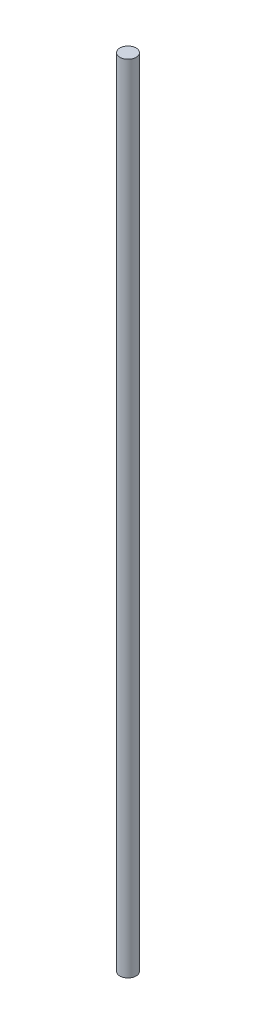
ISO-10303-21;
HEADER;
FILE_DESCRIPTION(('STEP AP214'),'2;1');
FILE_NAME('part.step','',(''),(''),'','','');
FILE_SCHEMA(('AUTOMOTIVE_DESIGN { 1 0 10303 214 1 1 1 1 }'));
ENDSEC;
DATA;
#1=APPLICATION_CONTEXT('core data for automotive mechanical design processes');
#2=APPLICATION_PROTOCOL_DEFINITION('international standard','automotive_design',2000,#1);
#3=PRODUCT_CONTEXT('',#1,'mechanical');
#4=PRODUCT('Part','Part','',(#3));
#5=PRODUCT_RELATED_PRODUCT_CATEGORY('part','',(#4));
#6=PRODUCT_DEFINITION_FORMATION('','',#4);
#7=PRODUCT_DEFINITION_CONTEXT('part definition',#1,'design');
#8=PRODUCT_DEFINITION('design','',#6,#7);
#9=PRODUCT_DEFINITION_SHAPE('','',#8);
#10=(LENGTH_UNIT() NAMED_UNIT(*) SI_UNIT(.MILLI.,.METRE.));
#11=(NAMED_UNIT(*) PLANE_ANGLE_UNIT() SI_UNIT($,.RADIAN.));
#12=(NAMED_UNIT(*) SI_UNIT($,.STERADIAN.) SOLID_ANGLE_UNIT());
#13=UNCERTAINTY_MEASURE_WITH_UNIT(LENGTH_MEASURE(1.E-05),#10,'distance_accuracy_value','');
#14=(GEOMETRIC_REPRESENTATION_CONTEXT(3) GLOBAL_UNCERTAINTY_ASSIGNED_CONTEXT((#13)) GLOBAL_UNIT_ASSIGNED_CONTEXT((#10,
#11,#12)) REPRESENTATION_CONTEXT('',''));
#15=CARTESIAN_POINT('',(0.,0.,0.));
#16=DIRECTION('',(0.,0.,1.));
#17=DIRECTION('',(1.,0.,0.));
#18=AXIS2_PLACEMENT_3D('',#15,#16,#17);
#19=CARTESIAN_POINT('',(0.,392.,0.));
#20=DIRECTION('',(0.,-1.,0.));
#21=DIRECTION('',(0.,0.,-1.));
#22=AXIS2_PLACEMENT_3D('',#19,#20,#21);
#23=CYLINDRICAL_SURFACE('',#22,4.);
#24=CARTESIAN_POINT('',(0.,392.,0.));
#25=DIRECTION('',(0.,1.,0.));
#26=DIRECTION('',(0.,0.,1.));
#27=AXIS2_PLACEMENT_3D('',#24,#25,#26);
#28=CIRCLE('',#27,4.);
#29=CARTESIAN_POINT('',(0.,392.,4.));
#30=VERTEX_POINT('',#29);
#31=EDGE_CURVE('E10',#30,#30,#28,.T.);
#32=ORIENTED_EDGE('',*,*,#31,.F.);
#33=EDGE_LOOP('',(#32));
#34=FACE_BOUND('',#33,.T.);
#35=CARTESIAN_POINT('',(0.,0.,0.));
#36=DIRECTION('',(0.,1.,0.));
#37=DIRECTION('',(0.,0.,1.));
#38=AXIS2_PLACEMENT_3D('',#35,#36,#37);
#39=CIRCLE('',#38,4.);
#40=CARTESIAN_POINT('',(0.,0.,4.));
#41=VERTEX_POINT('',#40);
#42=EDGE_CURVE('E36',#41,#41,#39,.T.);
#43=ORIENTED_EDGE('',*,*,#42,.T.);
#44=EDGE_LOOP('',(#43));
#45=FACE_BOUND('',#44,.T.);
#46=ADVANCED_FACE('F33',(#34,#45),#23,.T.);
#47=CARTESIAN_POINT('',(0.,392.,0.));
#48=DIRECTION('',(0.,1.,0.));
#49=DIRECTION('',(0.,0.,1.));
#50=AXIS2_PLACEMENT_3D('',#47,#48,#49);
#51=PLANE('',#50);
#52=ORIENTED_EDGE('',*,*,#31,.T.);
#53=EDGE_LOOP('',(#52));
#54=FACE_BOUND('',#53,.T.);
#55=ADVANCED_FACE('F48',(#54),#51,.T.);
#56=CARTESIAN_POINT('',(0.,0.,0.));
#57=DIRECTION('',(0.,1.,0.));
#58=DIRECTION('',(0.,0.,1.));
#59=AXIS2_PLACEMENT_3D('',#56,#57,#58);
#60=PLANE('',#59);
#61=ORIENTED_EDGE('',*,*,#42,.F.);
#62=EDGE_LOOP('',(#61));
#63=FACE_BOUND('',#62,.T.);
#64=ADVANCED_FACE('F46',(#63),#60,.F.);
#65=CLOSED_SHELL('',(#46,#55,#64));
#66=MANIFOLD_SOLID_BREP('B2',#65);
#67=ADVANCED_BREP_SHAPE_REPRESENTATION('',(#18,#66),#14);
#68=SHAPE_DEFINITION_REPRESENTATION(#9,#67);
ENDSEC;
END-ISO-10303-21;
